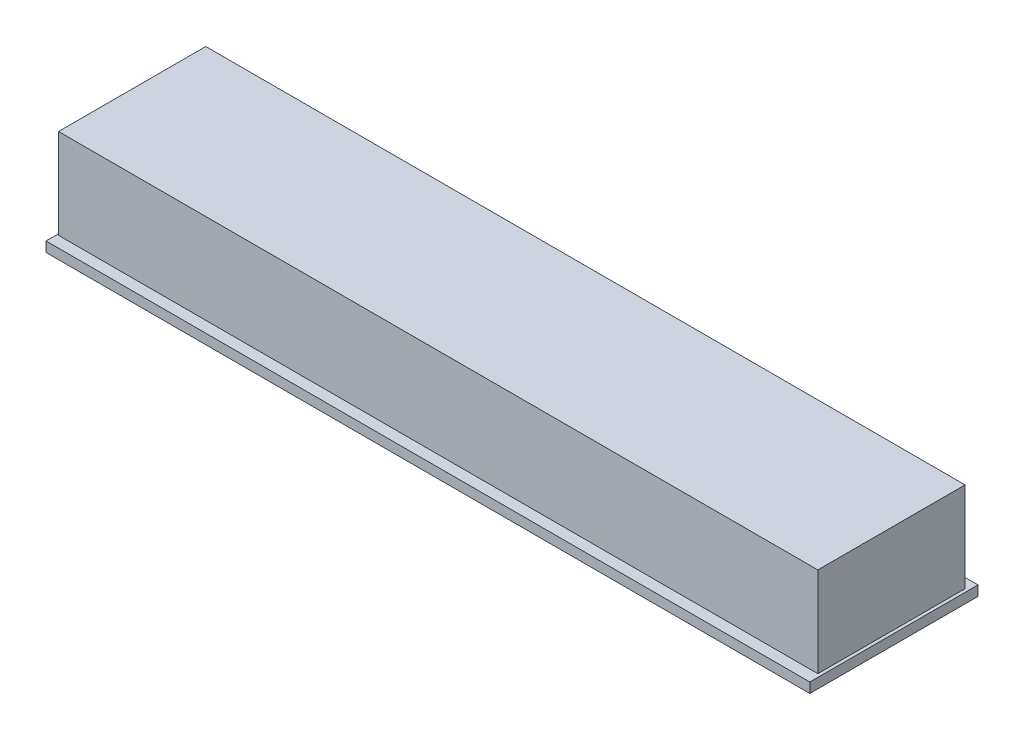
ISO-10303-21;
HEADER;
FILE_DESCRIPTION(('STEP AP214'),'2;1');
FILE_NAME('part.step','',(''),(''),'','','');
FILE_SCHEMA(('AUTOMOTIVE_DESIGN { 1 0 10303 214 1 1 1 1 }'));
ENDSEC;
DATA;
#1=APPLICATION_CONTEXT('core data for automotive mechanical design processes');
#2=APPLICATION_PROTOCOL_DEFINITION('international standard','automotive_design',2000,#1);
#3=PRODUCT_CONTEXT('',#1,'mechanical');
#4=PRODUCT('Part','Part','',(#3));
#5=PRODUCT_RELATED_PRODUCT_CATEGORY('part','',(#4));
#6=PRODUCT_DEFINITION_FORMATION('','',#4);
#7=PRODUCT_DEFINITION_CONTEXT('part definition',#1,'design');
#8=PRODUCT_DEFINITION('design','',#6,#7);
#9=PRODUCT_DEFINITION_SHAPE('','',#8);
#10=(LENGTH_UNIT() NAMED_UNIT(*) SI_UNIT(.MILLI.,.METRE.));
#11=(NAMED_UNIT(*) PLANE_ANGLE_UNIT() SI_UNIT($,.RADIAN.));
#12=(NAMED_UNIT(*) SI_UNIT($,.STERADIAN.) SOLID_ANGLE_UNIT());
#13=UNCERTAINTY_MEASURE_WITH_UNIT(LENGTH_MEASURE(1.E-05),#10,'distance_accuracy_value','');
#14=(GEOMETRIC_REPRESENTATION_CONTEXT(3) GLOBAL_UNCERTAINTY_ASSIGNED_CONTEXT((#13)) GLOBAL_UNIT_ASSIGNED_CONTEXT((#10,
#11,#12)) REPRESENTATION_CONTEXT('',''));
#15=CARTESIAN_POINT('',(0.,0.,0.));
#16=DIRECTION('',(0.,0.,1.));
#17=DIRECTION('',(1.,0.,0.));
#18=AXIS2_PLACEMENT_3D('',#15,#16,#17);
#19=CARTESIAN_POINT('',(-5.10128825194554,4.1471998659724,-35.0542031437056));
#20=DIRECTION('',(0.,1.,0.));
#21=DIRECTION('',(0.,0.,1.));
#22=AXIS2_PLACEMENT_3D('',#19,#20,#21);
#23=PLANE('',#22);
#24=DIRECTION('',(0.,0.,1.));
#25=VECTOR('',#24,1.);
#26=CARTESIAN_POINT('',(-14.0063637609626,4.1471998659724,-45.4885683998304));
#27=LINE('',#26,#25);
#28=CARTESIAN_POINT('',(-14.0063637609626,4.1471998659724,-45.4885683998304));
#29=VERTEX_POINT('',#28);
#30=CARTESIAN_POINT('',(-14.0063637609626,4.1471998659724,-42.1226441236611));
#31=VERTEX_POINT('',#30);
#32=EDGE_CURVE('E145',#29,#31,#27,.T.);
#33=ORIENTED_EDGE('',*,*,#32,.T.);
#34=DIRECTION('',(1.,0.,0.));
#35=VECTOR('',#34,1.);
#36=CARTESIAN_POINT('',(-14.0063637609626,4.1471998659724,-42.1226441236611));
#37=LINE('',#36,#35);
#38=CARTESIAN_POINT('',(1.28454937934916,4.1471998659724,-42.1226441236611));
#39=VERTEX_POINT('',#38);
#40=EDGE_CURVE('E84',#31,#39,#37,.T.);
#41=ORIENTED_EDGE('',*,*,#40,.T.);
#42=DIRECTION('',(0.,0.,1.));
#43=VECTOR('',#42,1.);
#44=CARTESIAN_POINT('',(1.28454937934916,4.1471998659724,-45.4885683998304));
#45=LINE('',#44,#43);
#46=CARTESIAN_POINT('',(1.28454937934916,4.1471998659724,-45.4885683998304));
#47=VERTEX_POINT('',#46);
#48=EDGE_CURVE('E149',#47,#39,#45,.T.);
#49=ORIENTED_EDGE('',*,*,#48,.F.);
#50=DIRECTION('',(1.,0.,0.));
#51=VECTOR('',#50,1.);
#52=CARTESIAN_POINT('',(-14.0063637609626,4.1471998659724,-45.4885683998304));
#53=LINE('',#52,#51);
#54=EDGE_CURVE('E152',#29,#47,#53,.T.);
#55=ORIENTED_EDGE('',*,*,#54,.F.);
#56=EDGE_LOOP('',(#33,#41,#49,#55));
#57=FACE_BOUND('',#56,.T.);
#58=DIRECTION('',(-1.,0.,0.));
#59=VECTOR('',#58,1.);
#60=CARTESIAN_POINT('',(-5.10128825194554,4.1471998659724,-42.3456327482965));
#61=LINE('',#60,#59);
#62=CARTESIAN_POINT('',(1.22138518095858,4.1471998659724,-42.3456327482965));
#63=VERTEX_POINT('',#62);
#64=CARTESIAN_POINT('',(-13.9786148190414,4.1471998659724,-42.3456327482965));
#65=VERTEX_POINT('',#64);
#66=EDGE_CURVE('E141',#63,#65,#61,.T.);
#67=ORIENTED_EDGE('',*,*,#66,.T.);
#68=DIRECTION('',(0.,0.,-1.));
#69=VECTOR('',#68,1.);
#70=CARTESIAN_POINT('',(-13.9786148190414,4.1471998659724,-35.0542031437056));
#71=LINE('',#70,#69);
#72=CARTESIAN_POINT('',(-13.9786148190414,4.1471998659724,-45.2929764110662));
#73=VERTEX_POINT('',#72);
#74=EDGE_CURVE('E130',#65,#73,#71,.T.);
#75=ORIENTED_EDGE('',*,*,#74,.T.);
#76=DIRECTION('',(1.,0.,0.));
#77=VECTOR('',#76,1.);
#78=CARTESIAN_POINT('',(-5.10128825194554,4.1471998659724,-45.2929764110662));
#79=LINE('',#78,#77);
#80=CARTESIAN_POINT('',(1.22138518095858,4.1471998659724,-45.2929764110662));
#81=VERTEX_POINT('',#80);
#82=EDGE_CURVE('E131',#73,#81,#79,.T.);
#83=ORIENTED_EDGE('',*,*,#82,.T.);
#84=DIRECTION('',(0.,0.,1.));
#85=VECTOR('',#84,1.);
#86=CARTESIAN_POINT('',(1.22138518095858,4.1471998659724,-35.0542031437056));
#87=LINE('',#86,#85);
#88=EDGE_CURVE('E134',#81,#63,#87,.T.);
#89=ORIENTED_EDGE('',*,*,#88,.T.);
#90=EDGE_LOOP('',(#67,#75,#83,#89));
#91=FACE_BOUND('',#90,.T.);
#92=ADVANCED_FACE('F34',(#57,#91),#23,.T.);
#93=CARTESIAN_POINT('',(-14.0063637609626,4.1471998659724,-45.4885683998304));
#94=DIRECTION('',(1.,0.,0.));
#95=DIRECTION('',(0.,0.,-1.));
#96=AXIS2_PLACEMENT_3D('',#93,#94,#95);
#97=PLANE('',#96);
#98=DIRECTION('',(0.,0.,1.));
#99=VECTOR('',#98,1.);
#100=CARTESIAN_POINT('',(-14.0063637609626,3.9471998659724,-45.4885683998304));
#101=LINE('',#100,#99);
#102=CARTESIAN_POINT('',(-14.0063637609626,3.9471998659724,-45.4885683998304));
#103=VERTEX_POINT('',#102);
#104=CARTESIAN_POINT('',(-14.0063637609626,3.9471998659724,-42.1226441236611));
#105=VERTEX_POINT('',#104);
#106=EDGE_CURVE('E144',#103,#105,#101,.T.);
#107=ORIENTED_EDGE('',*,*,#106,.T.);
#108=DIRECTION('',(0.,-1.,0.));
#109=VECTOR('',#108,1.);
#110=CARTESIAN_POINT('',(-14.0063637609626,4.1471998659724,-42.1226441236611));
#111=LINE('',#110,#109);
#112=EDGE_CURVE('E11',#31,#105,#111,.T.);
#113=ORIENTED_EDGE('',*,*,#112,.F.);
#114=ORIENTED_EDGE('',*,*,#32,.F.);
#115=DIRECTION('',(0.,-1.,0.));
#116=VECTOR('',#115,1.);
#117=CARTESIAN_POINT('',(-14.0063637609626,4.1471998659724,-45.4885683998304));
#118=LINE('',#117,#116);
#119=EDGE_CURVE('E58',#29,#103,#118,.T.);
#120=ORIENTED_EDGE('',*,*,#119,.T.);
#121=EDGE_LOOP('',(#107,#113,#114,#120));
#122=FACE_BOUND('',#121,.T.);
#123=ADVANCED_FACE('F36',(#122),#97,.F.);
#124=CARTESIAN_POINT('',(-14.0063637609626,4.1471998659724,-42.1226441236611));
#125=DIRECTION('',(0.,0.,-1.));
#126=DIRECTION('',(-1.,0.,0.));
#127=AXIS2_PLACEMENT_3D('',#124,#125,#126);
#128=PLANE('',#127);
#129=DIRECTION('',(1.,0.,0.));
#130=VECTOR('',#129,1.);
#131=CARTESIAN_POINT('',(-14.0063637609626,3.9471998659724,-42.1226441236611));
#132=LINE('',#131,#130);
#133=CARTESIAN_POINT('',(1.28454937934916,3.9471998659724,-42.1226441236611));
#134=VERTEX_POINT('',#133);
#135=EDGE_CURVE('E155',#105,#134,#132,.T.);
#136=ORIENTED_EDGE('',*,*,#135,.T.);
#137=DIRECTION('',(0.,-1.,0.));
#138=VECTOR('',#137,1.);
#139=CARTESIAN_POINT('',(1.28454937934916,4.1471998659724,-42.1226441236611));
#140=LINE('',#139,#138);
#141=EDGE_CURVE('E42',#39,#134,#140,.T.);
#142=ORIENTED_EDGE('',*,*,#141,.F.);
#143=ORIENTED_EDGE('',*,*,#40,.F.);
#144=ORIENTED_EDGE('',*,*,#112,.T.);
#145=EDGE_LOOP('',(#136,#142,#143,#144));
#146=FACE_BOUND('',#145,.T.);
#147=ADVANCED_FACE('F169',(#146),#128,.F.);
#148=CARTESIAN_POINT('',(1.28454937934916,4.1471998659724,-45.4885683998304));
#149=DIRECTION('',(1.,0.,0.));
#150=DIRECTION('',(0.,0.,-1.));
#151=AXIS2_PLACEMENT_3D('',#148,#149,#150);
#152=PLANE('',#151);
#153=DIRECTION('',(0.,0.,1.));
#154=VECTOR('',#153,1.);
#155=CARTESIAN_POINT('',(1.28454937934916,3.9471998659724,-45.4885683998304));
#156=LINE('',#155,#154);
#157=CARTESIAN_POINT('',(1.28454937934916,3.9471998659724,-45.4885683998304));
#158=VERTEX_POINT('',#157);
#159=EDGE_CURVE('E158',#158,#134,#156,.T.);
#160=ORIENTED_EDGE('',*,*,#159,.F.);
#161=DIRECTION('',(0.,-1.,0.));
#162=VECTOR('',#161,1.);
#163=CARTESIAN_POINT('',(1.28454937934916,4.1471998659724,-45.4885683998304));
#164=LINE('',#163,#162);
#165=EDGE_CURVE('E164',#47,#158,#164,.T.);
#166=ORIENTED_EDGE('',*,*,#165,.F.);
#167=ORIENTED_EDGE('',*,*,#48,.T.);
#168=ORIENTED_EDGE('',*,*,#141,.T.);
#169=EDGE_LOOP('',(#160,#166,#167,#168));
#170=FACE_BOUND('',#169,.T.);
#171=ADVANCED_FACE('F167',(#170),#152,.T.);
#172=CARTESIAN_POINT('',(-14.0063637609626,4.1471998659724,-45.4885683998304));
#173=DIRECTION('',(0.,0.,-1.));
#174=DIRECTION('',(-1.,0.,0.));
#175=AXIS2_PLACEMENT_3D('',#172,#173,#174);
#176=PLANE('',#175);
#177=DIRECTION('',(1.,0.,0.));
#178=VECTOR('',#177,1.);
#179=CARTESIAN_POINT('',(-14.0063637609626,3.9471998659724,-45.4885683998304));
#180=LINE('',#179,#178);
#181=EDGE_CURVE('E147',#103,#158,#180,.T.);
#182=ORIENTED_EDGE('',*,*,#181,.F.);
#183=ORIENTED_EDGE('',*,*,#119,.F.);
#184=ORIENTED_EDGE('',*,*,#54,.T.);
#185=ORIENTED_EDGE('',*,*,#165,.T.);
#186=EDGE_LOOP('',(#182,#183,#184,#185));
#187=FACE_BOUND('',#186,.T.);
#188=ADVANCED_FACE('F173',(#187),#176,.T.);
#189=CARTESIAN_POINT('',(-5.10128825194554,3.9471998659724,-35.0542031437056));
#190=DIRECTION('',(0.,1.,0.));
#191=DIRECTION('',(0.,0.,1.));
#192=AXIS2_PLACEMENT_3D('',#189,#190,#191);
#193=PLANE('',#192);
#194=ORIENTED_EDGE('',*,*,#106,.F.);
#195=ORIENTED_EDGE('',*,*,#181,.T.);
#196=ORIENTED_EDGE('',*,*,#159,.T.);
#197=ORIENTED_EDGE('',*,*,#135,.F.);
#198=EDGE_LOOP('',(#194,#195,#196,#197));
#199=FACE_BOUND('',#198,.T.);
#200=ADVANCED_FACE('F172',(#199),#193,.F.);
#201=CARTESIAN_POINT('',(-13.9786148190414,5.9471998659724,-42.3456327482965));
#202=DIRECTION('',(1.,0.,0.));
#203=DIRECTION('',(0.,0.,-1.));
#204=AXIS2_PLACEMENT_3D('',#201,#202,#203);
#205=PLANE('',#204);
#206=ORIENTED_EDGE('',*,*,#74,.F.);
#207=DIRECTION('',(0.,-1.,0.));
#208=VECTOR('',#207,1.);
#209=CARTESIAN_POINT('',(-13.9786148190414,5.9471998659724,-42.3456327482965));
#210=LINE('',#209,#208);
#211=CARTESIAN_POINT('',(-13.9786148190414,5.9471998659724,-42.3456327482965));
#212=VERTEX_POINT('',#211);
#213=EDGE_CURVE('E112',#212,#65,#210,.T.);
#214=ORIENTED_EDGE('',*,*,#213,.F.);
#215=DIRECTION('',(0.,0.,1.));
#216=VECTOR('',#215,1.);
#217=CARTESIAN_POINT('',(-13.9786148190414,5.9471998659724,-42.3456327482965));
#218=LINE('',#217,#216);
#219=CARTESIAN_POINT('',(-13.9786148190414,5.9471998659724,-45.2929764110662));
#220=VERTEX_POINT('',#219);
#221=EDGE_CURVE('E119',#220,#212,#218,.T.);
#222=ORIENTED_EDGE('',*,*,#221,.F.);
#223=DIRECTION('',(0.,-1.,0.));
#224=VECTOR('',#223,1.);
#225=CARTESIAN_POINT('',(-13.9786148190414,5.9471998659724,-45.2929764110662));
#226=LINE('',#225,#224);
#227=EDGE_CURVE('E266',#220,#73,#226,.T.);
#228=ORIENTED_EDGE('',*,*,#227,.T.);
#229=EDGE_LOOP('',(#206,#214,#222,#228));
#230=FACE_BOUND('',#229,.T.);
#231=ADVANCED_FACE('F128',(#230),#205,.F.);
#232=CARTESIAN_POINT('',(-13.9786148190414,5.9471998659724,-42.3456327482965));
#233=DIRECTION('',(0.,0.,-1.));
#234=DIRECTION('',(-1.,0.,0.));
#235=AXIS2_PLACEMENT_3D('',#232,#233,#234);
#236=PLANE('',#235);
#237=ORIENTED_EDGE('',*,*,#66,.F.);
#238=DIRECTION('',(0.,-1.,0.));
#239=VECTOR('',#238,1.);
#240=CARTESIAN_POINT('',(1.22138518095858,5.9471998659724,-42.3456327482965));
#241=LINE('',#240,#239);
#242=CARTESIAN_POINT('',(1.22138518095858,5.9471998659724,-42.3456327482965));
#243=VERTEX_POINT('',#242);
#244=EDGE_CURVE('E115',#243,#63,#241,.T.);
#245=ORIENTED_EDGE('',*,*,#244,.F.);
#246=DIRECTION('',(1.,0.,0.));
#247=VECTOR('',#246,1.);
#248=CARTESIAN_POINT('',(-13.9786148190414,5.9471998659724,-42.3456327482965));
#249=LINE('',#248,#247);
#250=EDGE_CURVE('E108',#212,#243,#249,.T.);
#251=ORIENTED_EDGE('',*,*,#250,.F.);
#252=ORIENTED_EDGE('',*,*,#213,.T.);
#253=EDGE_LOOP('',(#237,#245,#251,#252));
#254=FACE_BOUND('',#253,.T.);
#255=ADVANCED_FACE('F110',(#254),#236,.F.);
#256=CARTESIAN_POINT('',(1.22138518095858,5.9471998659724,-42.3456327482965));
#257=DIRECTION('',(-1.,0.,0.));
#258=DIRECTION('',(0.,0.,1.));
#259=AXIS2_PLACEMENT_3D('',#256,#257,#258);
#260=PLANE('',#259);
#261=ORIENTED_EDGE('',*,*,#88,.F.);
#262=DIRECTION('',(0.,-1.,0.));
#263=VECTOR('',#262,1.);
#264=CARTESIAN_POINT('',(1.22138518095858,5.9471998659724,-45.2929764110662));
#265=LINE('',#264,#263);
#266=CARTESIAN_POINT('',(1.22138518095858,5.9471998659724,-45.2929764110662));
#267=VERTEX_POINT('',#266);
#268=EDGE_CURVE('E49',#267,#81,#265,.T.);
#269=ORIENTED_EDGE('',*,*,#268,.F.);
#270=DIRECTION('',(0.,0.,-1.));
#271=VECTOR('',#270,1.);
#272=CARTESIAN_POINT('',(1.22138518095858,5.9471998659724,-42.3456327482965));
#273=LINE('',#272,#271);
#274=EDGE_CURVE('E118',#243,#267,#273,.T.);
#275=ORIENTED_EDGE('',*,*,#274,.F.);
#276=ORIENTED_EDGE('',*,*,#244,.T.);
#277=EDGE_LOOP('',(#261,#269,#275,#276));
#278=FACE_BOUND('',#277,.T.);
#279=ADVANCED_FACE('F216',(#278),#260,.F.);
#280=CARTESIAN_POINT('',(-13.9786148190414,5.9471998659724,-45.2929764110662));
#281=DIRECTION('',(0.,0.,1.));
#282=DIRECTION('',(1.,0.,0.));
#283=AXIS2_PLACEMENT_3D('',#280,#281,#282);
#284=PLANE('',#283);
#285=ORIENTED_EDGE('',*,*,#82,.F.);
#286=ORIENTED_EDGE('',*,*,#227,.F.);
#287=DIRECTION('',(-1.,0.,0.));
#288=VECTOR('',#287,1.);
#289=CARTESIAN_POINT('',(-13.9786148190414,5.9471998659724,-45.2929764110662));
#290=LINE('',#289,#288);
#291=EDGE_CURVE('E123',#267,#220,#290,.T.);
#292=ORIENTED_EDGE('',*,*,#291,.F.);
#293=ORIENTED_EDGE('',*,*,#268,.T.);
#294=EDGE_LOOP('',(#285,#286,#292,#293));
#295=FACE_BOUND('',#294,.T.);
#296=ADVANCED_FACE('F222',(#295),#284,.F.);
#297=CARTESIAN_POINT('',(-5.10128825194554,5.9471998659724,-35.0542031437056));
#298=DIRECTION('',(0.,-1.,0.));
#299=DIRECTION('',(0.,0.,-1.));
#300=AXIS2_PLACEMENT_3D('',#297,#298,#299);
#301=PLANE('',#300);
#302=ORIENTED_EDGE('',*,*,#221,.T.);
#303=ORIENTED_EDGE('',*,*,#250,.T.);
#304=ORIENTED_EDGE('',*,*,#274,.T.);
#305=ORIENTED_EDGE('',*,*,#291,.T.);
#306=EDGE_LOOP('',(#302,#303,#304,#305));
#307=FACE_BOUND('',#306,.T.);
#308=ADVANCED_FACE('F122',(#307),#301,.F.);
#309=CLOSED_SHELL('',(#92,#123,#147,#171,#188,#200,#231,#255,#279,#296,#308));
#310=MANIFOLD_SOLID_BREP('B2',#309);
#311=ADVANCED_BREP_SHAPE_REPRESENTATION('',(#18,#310),#14);
#312=SHAPE_DEFINITION_REPRESENTATION(#9,#311);
ENDSEC;
END-ISO-10303-21;
